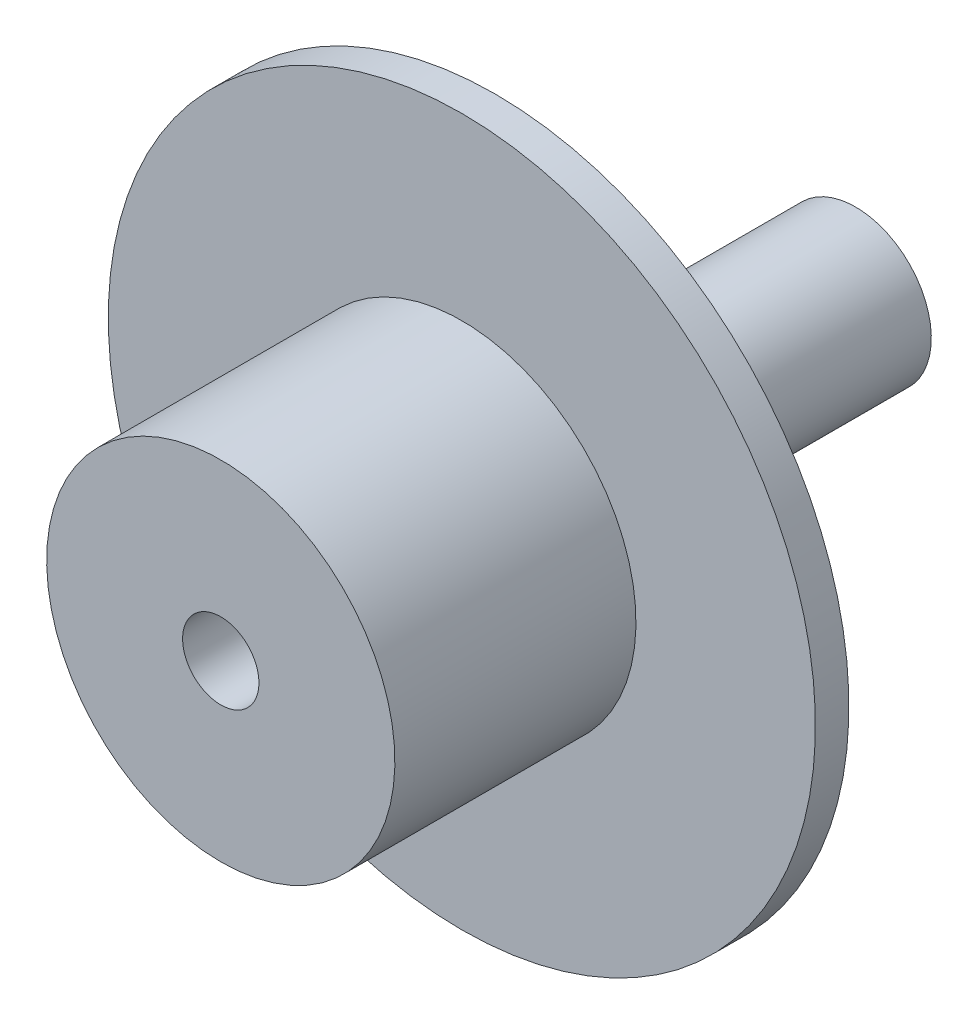
ISO-10303-21;
HEADER;
FILE_DESCRIPTION(('STEP AP214'),'2;1');
FILE_NAME('part.step','',(''),(''),'','','');
FILE_SCHEMA(('AUTOMOTIVE_DESIGN { 1 0 10303 214 1 1 1 1 }'));
ENDSEC;
DATA;
#1=APPLICATION_CONTEXT('core data for automotive mechanical design processes');
#2=APPLICATION_PROTOCOL_DEFINITION('international standard','automotive_design',2000,#1);
#3=PRODUCT_CONTEXT('',#1,'mechanical');
#4=PRODUCT('Part','Part','',(#3));
#5=PRODUCT_RELATED_PRODUCT_CATEGORY('part','',(#4));
#6=PRODUCT_DEFINITION_FORMATION('','',#4);
#7=PRODUCT_DEFINITION_CONTEXT('part definition',#1,'design');
#8=PRODUCT_DEFINITION('design','',#6,#7);
#9=PRODUCT_DEFINITION_SHAPE('','',#8);
#10=(LENGTH_UNIT() NAMED_UNIT(*) SI_UNIT(.MILLI.,.METRE.));
#11=(NAMED_UNIT(*) PLANE_ANGLE_UNIT() SI_UNIT($,.RADIAN.));
#12=(NAMED_UNIT(*) SI_UNIT($,.STERADIAN.) SOLID_ANGLE_UNIT());
#13=UNCERTAINTY_MEASURE_WITH_UNIT(LENGTH_MEASURE(1.E-05),#10,'distance_accuracy_value','');
#14=(GEOMETRIC_REPRESENTATION_CONTEXT(3) GLOBAL_UNCERTAINTY_ASSIGNED_CONTEXT((#13)) GLOBAL_UNIT_ASSIGNED_CONTEXT((#10,
#11,#12)) REPRESENTATION_CONTEXT('',''));
#15=CARTESIAN_POINT('',(0.,0.,0.));
#16=DIRECTION('',(0.,0.,1.));
#17=DIRECTION('',(1.,0.,0.));
#18=AXIS2_PLACEMENT_3D('',#15,#16,#17);
#19=CARTESIAN_POINT('',(0.,0.,0.));
#20=DIRECTION('',(0.,0.,-1.));
#21=DIRECTION('',(0.,1.,0.));
#22=AXIS2_PLACEMENT_3D('',#19,#20,#21);
#23=PLANE('',#22);
#24=CARTESIAN_POINT('',(0.,0.,0.));
#25=DIRECTION('',(0.,0.,1.));
#26=DIRECTION('',(1.,0.,0.));
#27=AXIS2_PLACEMENT_3D('',#24,#25,#26);
#28=CIRCLE('',#27,28.5);
#29=CARTESIAN_POINT('',(28.5,0.,0.));
#30=VERTEX_POINT('',#29);
#31=EDGE_CURVE('E74',#30,#30,#28,.T.);
#32=ORIENTED_EDGE('',*,*,#31,.F.);
#33=EDGE_LOOP('',(#32));
#34=FACE_BOUND('',#33,.T.);
#35=CARTESIAN_POINT('',(0.,0.,0.));
#36=DIRECTION('',(0.,0.,1.));
#37=DIRECTION('',(0.,-1.,0.));
#38=AXIS2_PLACEMENT_3D('',#35,#36,#37);
#39=CIRCLE('',#38,130.);
#40=CARTESIAN_POINT('',(0.,-130.,0.));
#41=VERTEX_POINT('',#40);
#42=EDGE_CURVE('E10',#41,#41,#39,.T.);
#43=ORIENTED_EDGE('',*,*,#42,.T.);
#44=EDGE_LOOP('',(#43));
#45=FACE_BOUND('',#44,.T.);
#46=ADVANCED_FACE('F40',(#34,#45),#23,.F.);
#47=CARTESIAN_POINT('',(0.,0.,0.));
#48=DIRECTION('',(0.,0.,1.));
#49=DIRECTION('',(0.,-1.,0.));
#50=AXIS2_PLACEMENT_3D('',#47,#48,#49);
#51=CYLINDRICAL_SURFACE('',#50,130.);
#52=ORIENTED_EDGE('',*,*,#42,.F.);
#53=EDGE_LOOP('',(#52));
#54=FACE_BOUND('',#53,.T.);
#55=CARTESIAN_POINT('',(0.,0.,-180.));
#56=DIRECTION('',(0.,0.,1.));
#57=DIRECTION('',(0.,-1.,0.));
#58=AXIS2_PLACEMENT_3D('',#55,#56,#57);
#59=CIRCLE('',#58,130.);
#60=CARTESIAN_POINT('',(0.,-130.,-180.));
#61=VERTEX_POINT('',#60);
#62=EDGE_CURVE('E47',#61,#61,#59,.T.);
#63=ORIENTED_EDGE('',*,*,#62,.T.);
#64=EDGE_LOOP('',(#63));
#65=FACE_BOUND('',#64,.T.);
#66=ADVANCED_FACE('F93',(#54,#65),#51,.T.);
#67=CARTESIAN_POINT('',(0.,130.,-180.));
#68=DIRECTION('',(0.,0.,-1.));
#69=DIRECTION('',(0.,1.,0.));
#70=AXIS2_PLACEMENT_3D('',#67,#68,#69);
#71=PLANE('',#70);
#72=ORIENTED_EDGE('',*,*,#62,.F.);
#73=EDGE_LOOP('',(#72));
#74=FACE_BOUND('',#73,.T.);
#75=CARTESIAN_POINT('',(0.,0.,-180.));
#76=DIRECTION('',(0.,0.,1.));
#77=DIRECTION('',(0.,-1.,0.));
#78=AXIS2_PLACEMENT_3D('',#75,#76,#77);
#79=CIRCLE('',#78,264.);
#80=CARTESIAN_POINT('',(0.,-264.,-180.));
#81=VERTEX_POINT('',#80);
#82=EDGE_CURVE('E53',#81,#81,#79,.T.);
#83=ORIENTED_EDGE('',*,*,#82,.T.);
#84=EDGE_LOOP('',(#83));
#85=FACE_BOUND('',#84,.T.);
#86=ADVANCED_FACE('F97',(#74,#85),#71,.F.);
#87=CARTESIAN_POINT('',(0.,0.,0.));
#88=DIRECTION('',(0.,0.,1.));
#89=DIRECTION('',(0.,-1.,0.));
#90=AXIS2_PLACEMENT_3D('',#87,#88,#89);
#91=CYLINDRICAL_SURFACE('',#90,264.);
#92=ORIENTED_EDGE('',*,*,#82,.F.);
#93=EDGE_LOOP('',(#92));
#94=FACE_BOUND('',#93,.T.);
#95=CARTESIAN_POINT('',(0.,0.,-205.));
#96=DIRECTION('',(0.,0.,1.));
#97=DIRECTION('',(0.,-1.,0.));
#98=AXIS2_PLACEMENT_3D('',#95,#96,#97);
#99=CIRCLE('',#98,264.);
#100=CARTESIAN_POINT('',(0.,-264.,-205.));
#101=VERTEX_POINT('',#100);
#102=EDGE_CURVE('E59',#101,#101,#99,.T.);
#103=ORIENTED_EDGE('',*,*,#102,.T.);
#104=EDGE_LOOP('',(#103));
#105=FACE_BOUND('',#104,.T.);
#106=ADVANCED_FACE('F102',(#94,#105),#91,.T.);
#107=CARTESIAN_POINT('',(0.,264.,-205.));
#108=DIRECTION('',(0.,0.,1.));
#109=DIRECTION('',(0.,-1.,0.));
#110=AXIS2_PLACEMENT_3D('',#107,#108,#109);
#111=PLANE('',#110);
#112=ORIENTED_EDGE('',*,*,#102,.F.);
#113=EDGE_LOOP('',(#112));
#114=FACE_BOUND('',#113,.T.);
#115=CARTESIAN_POINT('',(0.,0.,-205.));
#116=DIRECTION('',(0.,0.,1.));
#117=DIRECTION('',(0.,-1.,0.));
#118=AXIS2_PLACEMENT_3D('',#115,#116,#117);
#119=CIRCLE('',#118,56.4999999999999);
#120=CARTESIAN_POINT('',(0.,-56.4999999999999,-205.));
#121=VERTEX_POINT('',#120);
#122=EDGE_CURVE('E65',#121,#121,#119,.T.);
#123=ORIENTED_EDGE('',*,*,#122,.T.);
#124=EDGE_LOOP('',(#123));
#125=FACE_BOUND('',#124,.T.);
#126=ADVANCED_FACE('F108',(#114,#125),#111,.F.);
#127=CARTESIAN_POINT('',(0.,0.,0.));
#128=DIRECTION('',(0.,0.,1.));
#129=DIRECTION('',(0.,-1.,0.));
#130=AXIS2_PLACEMENT_3D('',#127,#128,#129);
#131=CYLINDRICAL_SURFACE('',#130,56.4999999999999);
#132=ORIENTED_EDGE('',*,*,#122,.F.);
#133=EDGE_LOOP('',(#132));
#134=FACE_BOUND('',#133,.T.);
#135=CARTESIAN_POINT('',(0.,0.,-474.));
#136=DIRECTION('',(0.,0.,1.));
#137=DIRECTION('',(0.,-1.,0.));
#138=AXIS2_PLACEMENT_3D('',#135,#136,#137);
#139=CIRCLE('',#138,56.4999999999999);
#140=CARTESIAN_POINT('',(0.,-56.4999999999998,-474.));
#141=VERTEX_POINT('',#140);
#142=EDGE_CURVE('E69',#141,#141,#139,.T.);
#143=ORIENTED_EDGE('',*,*,#142,.T.);
#144=EDGE_LOOP('',(#143));
#145=FACE_BOUND('',#144,.T.);
#146=ADVANCED_FACE('F112',(#134,#145),#131,.T.);
#147=CARTESIAN_POINT('',(0.,56.5,-474.));
#148=DIRECTION('',(0.,0.,1.));
#149=DIRECTION('',(0.,-1.,0.));
#150=AXIS2_PLACEMENT_3D('',#147,#148,#149);
#151=PLANE('',#150);
#152=CARTESIAN_POINT('',(0.,0.,-474.));
#153=DIRECTION('',(0.,0.,1.));
#154=DIRECTION('',(1.,0.,0.));
#155=AXIS2_PLACEMENT_3D('',#152,#153,#154);
#156=CIRCLE('',#155,28.5);
#157=CARTESIAN_POINT('',(28.5,0.,-474.));
#158=VERTEX_POINT('',#157);
#159=EDGE_CURVE('E73',#158,#158,#156,.T.);
#160=ORIENTED_EDGE('',*,*,#159,.T.);
#161=EDGE_LOOP('',(#160));
#162=FACE_BOUND('',#161,.T.);
#163=ORIENTED_EDGE('',*,*,#142,.F.);
#164=EDGE_LOOP('',(#163));
#165=FACE_BOUND('',#164,.T.);
#166=ADVANCED_FACE('F83',(#162,#165),#151,.F.);
#167=CARTESIAN_POINT('',(0.,0.,-474.));
#168=DIRECTION('',(0.,0.,1.));
#169=DIRECTION('',(1.,0.,0.));
#170=AXIS2_PLACEMENT_3D('',#167,#168,#169);
#171=CYLINDRICAL_SURFACE('',#170,28.5);
#172=ORIENTED_EDGE('',*,*,#159,.F.);
#173=EDGE_LOOP('',(#172));
#174=FACE_BOUND('',#173,.T.);
#175=ORIENTED_EDGE('',*,*,#31,.T.);
#176=EDGE_LOOP('',(#175));
#177=FACE_BOUND('',#176,.T.);
#178=ADVANCED_FACE('F86',(#174,#177),#171,.F.);
#179=CLOSED_SHELL('',(#46,#66,#86,#106,#126,#146,#166,#178));
#180=MANIFOLD_SOLID_BREP('B2',#179);
#181=ADVANCED_BREP_SHAPE_REPRESENTATION('',(#18,#180),#14);
#182=SHAPE_DEFINITION_REPRESENTATION(#9,#181);
ENDSEC;
END-ISO-10303-21;
